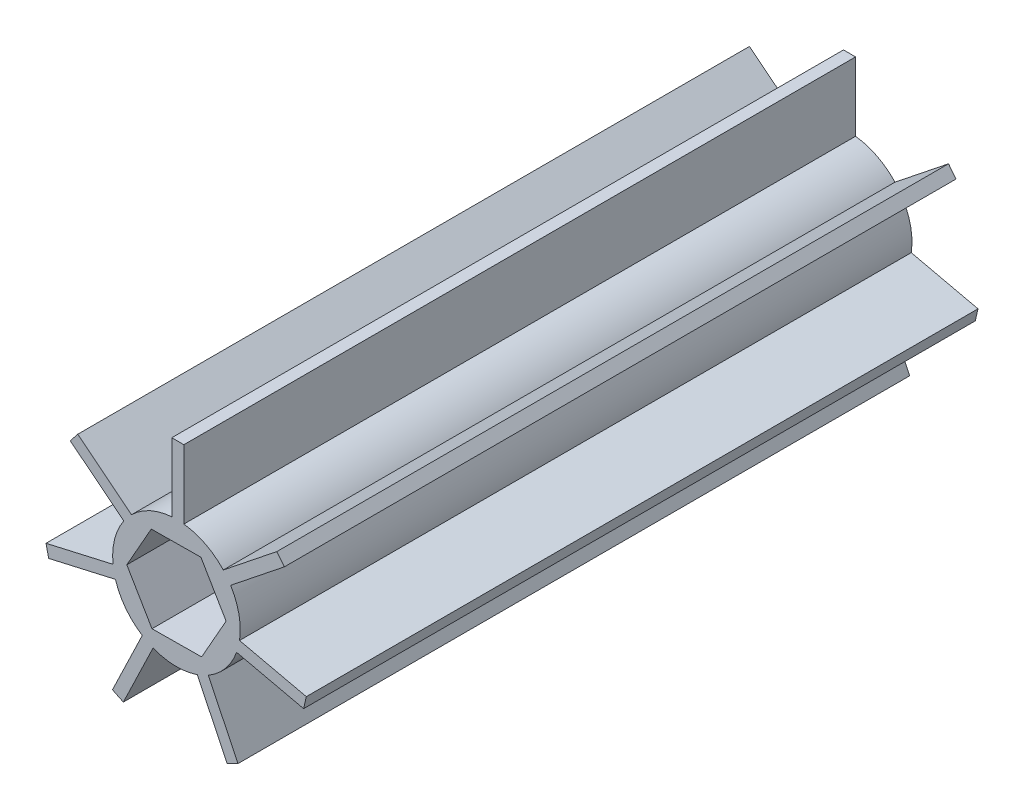
ISO-10303-21;
HEADER;
FILE_DESCRIPTION(('STEP AP214'),'2;1');
FILE_NAME('part.step','',(''),(''),'','','');
FILE_SCHEMA(('AUTOMOTIVE_DESIGN { 1 0 10303 214 1 1 1 1 }'));
ENDSEC;
DATA;
#1=APPLICATION_CONTEXT('core data for automotive mechanical design processes');
#2=APPLICATION_PROTOCOL_DEFINITION('international standard','automotive_design',2000,#1);
#3=PRODUCT_CONTEXT('',#1,'mechanical');
#4=PRODUCT('Part','Part','',(#3));
#5=PRODUCT_RELATED_PRODUCT_CATEGORY('part','',(#4));
#6=PRODUCT_DEFINITION_FORMATION('','',#4);
#7=PRODUCT_DEFINITION_CONTEXT('part definition',#1,'design');
#8=PRODUCT_DEFINITION('design','',#6,#7);
#9=PRODUCT_DEFINITION_SHAPE('','',#8);
#10=(LENGTH_UNIT() NAMED_UNIT(*) SI_UNIT(.MILLI.,.METRE.));
#11=(NAMED_UNIT(*) PLANE_ANGLE_UNIT() SI_UNIT($,.RADIAN.));
#12=(NAMED_UNIT(*) SI_UNIT($,.STERADIAN.) SOLID_ANGLE_UNIT());
#13=UNCERTAINTY_MEASURE_WITH_UNIT(LENGTH_MEASURE(1.E-05),#10,'distance_accuracy_value','');
#14=(GEOMETRIC_REPRESENTATION_CONTEXT(3) GLOBAL_UNCERTAINTY_ASSIGNED_CONTEXT((#13)) GLOBAL_UNIT_ASSIGNED_CONTEXT((#10,
#11,#12)) REPRESENTATION_CONTEXT('',''));
#15=CARTESIAN_POINT('',(0.,0.,0.));
#16=DIRECTION('',(0.,0.,1.));
#17=DIRECTION('',(1.,0.,0.));
#18=AXIS2_PLACEMENT_3D('',#15,#16,#17);
#19=CARTESIAN_POINT('',(0.,0.,-76.2));
#20=DIRECTION('',(0.,0.,1.));
#21=DIRECTION('',(1.,0.,0.));
#22=AXIS2_PLACEMENT_3D('',#19,#20,#21);
#23=CYLINDRICAL_SURFACE('',#22,7.239);
#24=DIRECTION('',(0.,0.,1.));
#25=VECTOR('',#24,1.);
#26=CARTESIAN_POINT('',(-5.09725781437556,5.14014433394503,-76.2));
#27=LINE('',#26,#25);
#28=CARTESIAN_POINT('',(-5.09725781437557,5.14014433394503,0.));
#29=VERTEX_POINT('',#28);
#30=CARTESIAN_POINT('',(-5.09725781437557,5.14014433394503,-76.2));
#31=VERTEX_POINT('',#30);
#32=EDGE_CURVE('E11',#29,#31,#27,.F.);
#33=ORIENTED_EDGE('',*,*,#32,.F.);
#34=CARTESIAN_POINT('',(0.,0.,0.));
#35=DIRECTION('',(0.,0.,1.));
#36=DIRECTION('',(1.,0.,0.));
#37=AXIS2_PLACEMENT_3D('',#34,#35,#36);
#38=CIRCLE('',#37,7.239);
#39=CARTESIAN_POINT('',(-0.5309616,7.21950142179676,0.));
#40=VERTEX_POINT('',#39);
#41=EDGE_CURVE('E439',#40,#29,#38,.T.);
#42=ORIENTED_EDGE('',*,*,#41,.F.);
#43=DIRECTION('',(0.,0.,1.));
#44=VECTOR('',#43,1.);
#45=CARTESIAN_POINT('',(-0.5309616,7.21950142179676,-76.2));
#46=LINE('',#45,#44);
#47=CARTESIAN_POINT('',(-0.5309616,7.21950142179676,-76.2));
#48=VERTEX_POINT('',#47);
#49=EDGE_CURVE('E436',#40,#48,#46,.F.);
#50=ORIENTED_EDGE('',*,*,#49,.T.);
#51=CARTESIAN_POINT('',(0.,0.,-76.2));
#52=DIRECTION('',(0.,0.,1.));
#53=DIRECTION('',(1.,0.,0.));
#54=AXIS2_PLACEMENT_3D('',#51,#52,#53);
#55=CIRCLE('',#54,7.239);
#56=EDGE_CURVE('E433',#48,#31,#55,.T.);
#57=ORIENTED_EDGE('',*,*,#56,.T.);
#58=EDGE_LOOP('',(#33,#42,#50,#57));
#59=FACE_BOUND('',#58,.T.);
#60=ADVANCED_FACE('F36',(#59),#23,.T.);
#61=DIRECTION('',(0.,0.,1.));
#62=VECTOR('',#61,1.);
#63=CARTESIAN_POINT('',(-5.97548264206201,4.0861630161333,-76.2));
#64=LINE('',#63,#62);
#65=CARTESIAN_POINT('',(-5.97548264206201,4.0861630161333,-76.2));
#66=VERTEX_POINT('',#65);
#67=CARTESIAN_POINT('',(-5.97548264206201,4.0861630161333,0.));
#68=VERTEX_POINT('',#67);
#69=EDGE_CURVE('E44',#66,#68,#64,.T.);
#70=ORIENTED_EDGE('',*,*,#69,.F.);
#71=CARTESIAN_POINT('',(-7.19681492941579,-0.780369061238331,-76.2));
#72=VERTEX_POINT('',#71);
#73=EDGE_CURVE('E437',#66,#72,#55,.T.);
#74=ORIENTED_EDGE('',*,*,#73,.T.);
#75=DIRECTION('',(0.,0.,1.));
#76=VECTOR('',#75,1.);
#77=CARTESIAN_POINT('',(-7.19681492941579,-0.780369061238331,-76.2));
#78=LINE('',#77,#76);
#79=CARTESIAN_POINT('',(-7.19681492941579,-0.780369061238331,0.));
#80=VERTEX_POINT('',#79);
#81=EDGE_CURVE('E495',#80,#72,#78,.F.);
#82=ORIENTED_EDGE('',*,*,#81,.F.);
#83=EDGE_CURVE('E442',#68,#80,#38,.T.);
#84=ORIENTED_EDGE('',*,*,#83,.F.);
#85=EDGE_LOOP('',(#70,#74,#82,#84));
#86=FACE_BOUND('',#85,.T.);
#87=ADVANCED_FACE('F507',(#86),#23,.T.);
#88=DIRECTION('',(0.,0.,1.));
#89=VECTOR('',#88,1.);
#90=CARTESIAN_POINT('',(-6.92034337701907,-2.1241394832139,-76.2));
#91=LINE('',#90,#89);
#92=CARTESIAN_POINT('',(-6.92034337701907,-2.1241394832139,-76.2));
#93=VERTEX_POINT('',#92);
#94=CARTESIAN_POINT('',(-6.92034337701907,-2.1241394832139,0.));
#95=VERTEX_POINT('',#94);
#96=EDGE_CURVE('E492',#93,#95,#91,.T.);
#97=ORIENTED_EDGE('',*,*,#96,.F.);
#98=CARTESIAN_POINT('',(-3.87702361433526,-6.11324863668138,-76.2));
#99=VERTEX_POINT('',#98);
#100=EDGE_CURVE('E554',#93,#99,#55,.T.);
#101=ORIENTED_EDGE('',*,*,#100,.T.);
#102=DIRECTION('',(0.,0.,1.));
#103=VECTOR('',#102,1.);
#104=CARTESIAN_POINT('',(-3.87702361433526,-6.11324863668138,-76.2));
#105=LINE('',#104,#103);
#106=CARTESIAN_POINT('',(-3.87702361433526,-6.11324863668138,0.));
#107=VERTEX_POINT('',#106);
#108=EDGE_CURVE('E489',#107,#99,#105,.F.);
#109=ORIENTED_EDGE('',*,*,#108,.F.);
#110=EDGE_CURVE('E510',#95,#107,#38,.T.);
#111=ORIENTED_EDGE('',*,*,#110,.F.);
#112=EDGE_LOOP('',(#97,#101,#109,#111));
#113=FACE_BOUND('',#112,.T.);
#114=ADVANCED_FACE('F594',(#113),#23,.T.);
#115=DIRECTION('',(0.,0.,1.));
#116=VECTOR('',#115,1.);
#117=CARTESIAN_POINT('',(-2.65404439980201,-6.73492162715199,-76.2));
#118=LINE('',#117,#116);
#119=CARTESIAN_POINT('',(-2.65404439980201,-6.73492162715199,-76.2));
#120=VERTEX_POINT('',#119);
#121=CARTESIAN_POINT('',(-2.65404439980201,-6.73492162715199,0.));
#122=VERTEX_POINT('',#121);
#123=EDGE_CURVE('E486',#120,#122,#118,.T.);
#124=ORIENTED_EDGE('',*,*,#123,.F.);
#125=CARTESIAN_POINT('',(2.36224555920875,-6.84272730115694,-76.2));
#126=VERTEX_POINT('',#125);
#127=EDGE_CURVE('E555',#120,#126,#55,.T.);
#128=ORIENTED_EDGE('',*,*,#127,.T.);
#129=DIRECTION('',(0.,0.,1.));
#130=VECTOR('',#129,1.);
#131=CARTESIAN_POINT('',(2.36224555920875,-6.84272730115694,-76.2));
#132=LINE('',#131,#130);
#133=CARTESIAN_POINT('',(2.36224555920875,-6.84272730115694,0.));
#134=VERTEX_POINT('',#133);
#135=EDGE_CURVE('E483',#134,#126,#132,.F.);
#136=ORIENTED_EDGE('',*,*,#135,.F.);
#137=EDGE_CURVE('E512',#122,#134,#38,.T.);
#138=ORIENTED_EDGE('',*,*,#137,.F.);
#139=EDGE_LOOP('',(#124,#128,#136,#138));
#140=FACE_BOUND('',#139,.T.);
#141=ADVANCED_FACE('F609',(#140),#23,.T.);
#142=DIRECTION('',(0.,0.,1.));
#143=VECTOR('',#142,1.);
#144=CARTESIAN_POINT('',(3.61080414310541,-6.27417041848026,-76.2));
#145=LINE('',#144,#143);
#146=CARTESIAN_POINT('',(3.61080414310541,-6.27417041848026,-76.2));
#147=VERTEX_POINT('',#146);
#148=CARTESIAN_POINT('',(3.61080414310541,-6.27417041848026,0.));
#149=VERTEX_POINT('',#148);
#150=EDGE_CURVE('E480',#147,#149,#145,.T.);
#151=ORIENTED_EDGE('',*,*,#150,.F.);
#152=CARTESIAN_POINT('',(6.82269564564073,-2.41949274166198,-76.2));
#153=VERTEX_POINT('',#152);
#154=EDGE_CURVE('E558',#147,#153,#55,.T.);
#155=ORIENTED_EDGE('',*,*,#154,.T.);
#156=DIRECTION('',(0.,0.,1.));
#157=VECTOR('',#156,1.);
#158=CARTESIAN_POINT('',(6.82269564564073,-2.41949274166197,-76.2));
#159=LINE('',#158,#157);
#160=CARTESIAN_POINT('',(6.82269564564073,-2.41949274166198,0.));
#161=VERTEX_POINT('',#160);
#162=EDGE_CURVE('E477',#161,#153,#159,.F.);
#163=ORIENTED_EDGE('',*,*,#162,.F.);
#164=EDGE_CURVE('E515',#149,#161,#38,.T.);
#165=ORIENTED_EDGE('',*,*,#164,.F.);
#166=EDGE_LOOP('',(#151,#155,#163,#165));
#167=FACE_BOUND('',#166,.T.);
#168=ADVANCED_FACE('F604',(#167),#23,.T.);
#169=DIRECTION('',(0.,0.,1.));
#170=VECTOR('',#169,1.);
#171=CARTESIAN_POINT('',(7.15664351927297,-1.08884091494037,-76.2));
#172=LINE('',#171,#170);
#173=CARTESIAN_POINT('',(7.15664351927297,-1.08884091494037,-76.2));
#174=VERTEX_POINT('',#173);
#175=CARTESIAN_POINT('',(7.15664351927297,-1.08884091494037,0.));
#176=VERTEX_POINT('',#175);
#177=EDGE_CURVE('E474',#174,#176,#172,.T.);
#178=ORIENTED_EDGE('',*,*,#177,.F.);
#179=CARTESIAN_POINT('',(6.14551675327719,3.82566920096201,-76.2));
#180=VERTEX_POINT('',#179);
#181=EDGE_CURVE('E561',#174,#180,#55,.T.);
#182=ORIENTED_EDGE('',*,*,#181,.T.);
#183=DIRECTION('',(0.,0.,1.));
#184=VECTOR('',#183,1.);
#185=CARTESIAN_POINT('',(6.14551675327719,3.82566920096201,-76.2));
#186=LINE('',#185,#184);
#187=CARTESIAN_POINT('',(6.14551675327719,3.82566920096201,0.));
#188=VERTEX_POINT('',#187);
#189=EDGE_CURVE('E471',#188,#180,#186,.F.);
#190=ORIENTED_EDGE('',*,*,#189,.F.);
#191=EDGE_CURVE('E518',#176,#188,#38,.T.);
#192=ORIENTED_EDGE('',*,*,#191,.F.);
#193=EDGE_LOOP('',(#178,#182,#190,#192));
#194=FACE_BOUND('',#193,.T.);
#195=ADVANCED_FACE('F566',(#194),#23,.T.);
#196=CARTESIAN_POINT('',(0.8406384,0.,-76.2));
#197=DIRECTION('',(1.,0.,0.));
#198=DIRECTION('',(0.,0.,-1.));
#199=AXIS2_PLACEMENT_3D('',#196,#197,#198);
#200=PLANE('',#199);
#201=DIRECTION('',(0.,0.,1.));
#202=VECTOR('',#201,1.);
#203=CARTESIAN_POINT('',(0.8406384,7.19002420583167,-76.2));
#204=LINE('',#203,#202);
#205=CARTESIAN_POINT('',(0.8406384,7.19002420583168,-76.2));
#206=VERTEX_POINT('',#205);
#207=CARTESIAN_POINT('',(0.8406384,7.19002420583168,0.));
#208=VERTEX_POINT('',#207);
#209=EDGE_CURVE('E444',#206,#208,#204,.T.);
#210=ORIENTED_EDGE('',*,*,#209,.F.);
#211=DIRECTION('',(0.,1.,0.));
#212=VECTOR('',#211,1.);
#213=CARTESIAN_POINT('',(0.8406384,0.,-76.2));
#214=LINE('',#213,#212);
#215=CARTESIAN_POINT('',(0.8406384,14.9878436421136,-76.2));
#216=VERTEX_POINT('',#215);
#217=EDGE_CURVE('E448',#206,#216,#214,.T.);
#218=ORIENTED_EDGE('',*,*,#217,.T.);
#219=DIRECTION('',(0.,0.,1.));
#220=VECTOR('',#219,1.);
#221=CARTESIAN_POINT('',(0.8406384,14.9878436421136,-76.2));
#222=LINE('',#221,#220);
#223=CARTESIAN_POINT('',(0.8406384,14.9878436421136,0.));
#224=VERTEX_POINT('',#223);
#225=EDGE_CURVE('E457',#216,#224,#222,.T.);
#226=ORIENTED_EDGE('',*,*,#225,.T.);
#227=DIRECTION('',(0.,1.,0.));
#228=VECTOR('',#227,1.);
#229=CARTESIAN_POINT('',(0.8406384,0.,0.));
#230=LINE('',#229,#228);
#231=EDGE_CURVE('E447',#208,#224,#230,.T.);
#232=ORIENTED_EDGE('',*,*,#231,.F.);
#233=EDGE_LOOP('',(#210,#218,#226,#232));
#234=FACE_BOUND('',#233,.T.);
#235=ADVANCED_FACE('F38',(#234),#200,.T.);
#236=CARTESIAN_POINT('',(-0.5309616,0.,-76.2));
#237=DIRECTION('',(-1.,0.,0.));
#238=DIRECTION('',(0.,0.,1.));
#239=AXIS2_PLACEMENT_3D('',#236,#237,#238);
#240=PLANE('',#239);
#241=ORIENTED_EDGE('',*,*,#49,.F.);
#242=DIRECTION('',(0.,-1.,0.));
#243=VECTOR('',#242,1.);
#244=CARTESIAN_POINT('',(-0.5309616,0.,0.));
#245=LINE('',#244,#243);
#246=CARTESIAN_POINT('',(-0.5309616,14.9878436421136,0.));
#247=VERTEX_POINT('',#246);
#248=EDGE_CURVE('E451',#247,#40,#245,.T.);
#249=ORIENTED_EDGE('',*,*,#248,.F.);
#250=DIRECTION('',(0.,0.,1.));
#251=VECTOR('',#250,1.);
#252=CARTESIAN_POINT('',(-0.5309616,14.9878436421136,-76.2));
#253=LINE('',#252,#251);
#254=CARTESIAN_POINT('',(-0.5309616,14.9878436421136,-76.2));
#255=VERTEX_POINT('',#254);
#256=EDGE_CURVE('E464',#255,#247,#253,.T.);
#257=ORIENTED_EDGE('',*,*,#256,.F.);
#258=DIRECTION('',(0.,-1.,0.));
#259=VECTOR('',#258,1.);
#260=CARTESIAN_POINT('',(-0.5309616,0.,-76.2));
#261=LINE('',#260,#259);
#262=EDGE_CURVE('E454',#255,#48,#261,.T.);
#263=ORIENTED_EDGE('',*,*,#262,.T.);
#264=EDGE_LOOP('',(#241,#249,#257,#263));
#265=FACE_BOUND('',#264,.T.);
#266=ADVANCED_FACE('F539',(#265),#240,.T.);
#267=CARTESIAN_POINT('',(-0.5309616,14.9878436421136,-76.2));
#268=DIRECTION('',(0.,1.,0.));
#269=DIRECTION('',(-1.,0.,0.));
#270=AXIS2_PLACEMENT_3D('',#267,#268,#269);
#271=PLANE('',#270);
#272=DIRECTION('',(-1.,0.,0.));
#273=VECTOR('',#272,1.);
#274=CARTESIAN_POINT('',(-0.5309616,14.9878436421136,0.));
#275=LINE('',#274,#273);
#276=EDGE_CURVE('E459',#224,#247,#275,.T.);
#277=ORIENTED_EDGE('',*,*,#276,.F.);
#278=ORIENTED_EDGE('',*,*,#225,.F.);
#279=DIRECTION('',(-1.,0.,0.));
#280=VECTOR('',#279,1.);
#281=CARTESIAN_POINT('',(-0.5309616,14.9878436421136,-76.2));
#282=LINE('',#281,#280);
#283=EDGE_CURVE('E450',#216,#255,#282,.T.);
#284=ORIENTED_EDGE('',*,*,#283,.T.);
#285=ORIENTED_EDGE('',*,*,#256,.T.);
#286=EDGE_LOOP('',(#277,#278,#284,#285));
#287=FACE_BOUND('',#286,.T.);
#288=ADVANCED_FACE('F535',(#287),#271,.T.);
#289=CARTESIAN_POINT('',(0.,0.,-76.2));
#290=DIRECTION('',(0.,0.,-1.));
#291=DIRECTION('',(-1.,0.,0.));
#292=AXIS2_PLACEMENT_3D('',#289,#290,#291);
#293=PLANE('',#292);
#294=DIRECTION('',(0.492619747113076,0.870244669477641,0.));
#295=VECTOR('',#294,1.);
#296=CARTESIAN_POINT('',(2.85697830858125,-4.85268783915638,-76.2));
#297=LINE('',#296,#295);
#298=CARTESIAN_POINT('',(2.85697830858125,-4.85268783915638,-76.2));
#299=VERTEX_POINT('',#298);
#300=CARTESIAN_POINT('',(5.63104009963586,0.047871873714276,-76.2));
#301=VERTEX_POINT('',#300);
#302=EDGE_CURVE('E258',#299,#301,#297,.T.);
#303=ORIENTED_EDGE('',*,*,#302,.T.);
#304=DIRECTION('',(-0.507344117719091,0.861743550144611,0.));
#305=VECTOR('',#304,1.);
#306=CARTESIAN_POINT('',(5.63104009963586,0.047871873714276,-76.2));
#307=LINE('',#306,#305);
#308=CARTESIAN_POINT('',(2.77406179105461,4.90055971287065,-76.2));
#309=VERTEX_POINT('',#308);
#310=EDGE_CURVE('E267',#301,#309,#307,.T.);
#311=ORIENTED_EDGE('',*,*,#310,.T.);
#312=DIRECTION('',(-0.999963864832168,-0.00850111933302995,0.));
#313=VECTOR('',#312,1.);
#314=CARTESIAN_POINT('',(2.77406179105461,4.90055971287065,-76.2));
#315=LINE('',#314,#313);
#316=CARTESIAN_POINT('',(-2.85697830858125,4.85268783915638,-76.2));
#317=VERTEX_POINT('',#316);
#318=EDGE_CURVE('E51',#309,#317,#315,.T.);
#319=ORIENTED_EDGE('',*,*,#318,.T.);
#320=DIRECTION('',(-0.492619747113076,-0.870244669477641,0.));
#321=VECTOR('',#320,1.);
#322=CARTESIAN_POINT('',(-2.85697830858125,4.85268783915638,-76.2));
#323=LINE('',#322,#321);
#324=CARTESIAN_POINT('',(-5.63104009963586,-0.0478718737142743,-76.2));
#325=VERTEX_POINT('',#324);
#326=EDGE_CURVE('E282',#317,#325,#323,.T.);
#327=ORIENTED_EDGE('',*,*,#326,.T.);
#328=DIRECTION('',(0.507344117719091,-0.861743550144611,0.));
#329=VECTOR('',#328,1.);
#330=CARTESIAN_POINT('',(-5.63104009963586,-0.0478718737142743,-76.2));
#331=LINE('',#330,#329);
#332=CARTESIAN_POINT('',(-2.77406179105461,-4.90055971287065,-76.2));
#333=VERTEX_POINT('',#332);
#334=EDGE_CURVE('E285',#325,#333,#331,.T.);
#335=ORIENTED_EDGE('',*,*,#334,.T.);
#336=DIRECTION('',(0.999963864832168,0.00850111933303011,0.));
#337=VECTOR('',#336,1.);
#338=CARTESIAN_POINT('',(-2.77406179105461,-4.90055971287065,-76.2));
#339=LINE('',#338,#337);
#340=EDGE_CURVE('E264',#333,#299,#339,.T.);
#341=ORIENTED_EDGE('',*,*,#340,.T.);
#342=EDGE_LOOP('',(#303,#311,#319,#327,#335,#341));
#343=FACE_BOUND('',#342,.T.);
#344=ORIENTED_EDGE('',*,*,#73,.F.);
#345=DIRECTION('',(0.781831482468031,-0.623489801858732,0.));
#346=VECTOR('',#345,1.);
#347=CARTESIAN_POINT('',(-0.331049142778595,-0.415122494861598,-76.2));
#348=LINE('',#347,#346);
#349=CARTESIAN_POINT('',(-12.0490171564913,8.92964516784947,-76.2));
#350=VERTEX_POINT('',#349);
#351=EDGE_CURVE('E420',#350,#66,#348,.T.);
#352=ORIENTED_EDGE('',*,*,#351,.F.);
#353=DIRECTION('',(-0.623489801858731,-0.781831482468032,0.));
#354=VECTOR('',#353,1.);
#355=CARTESIAN_POINT('',(-12.0490171564913,8.92964516784947,-76.2));
#356=LINE('',#355,#354);
#357=CARTESIAN_POINT('',(-11.1938385442619,10.0020052292026,-76.2));
#358=VERTEX_POINT('',#357);
#359=EDGE_CURVE('E416',#358,#350,#356,.T.);
#360=ORIENTED_EDGE('',*,*,#359,.F.);
#361=DIRECTION('',(-0.781831482468031,0.623489801858732,0.));
#362=VECTOR('',#361,1.);
#363=CARTESIAN_POINT('',(0.524129469450841,0.657237566491554,-76.2));
#364=LINE('',#363,#362);
#365=EDGE_CURVE('E414',#31,#358,#364,.T.);
#366=ORIENTED_EDGE('',*,*,#365,.F.);
#367=ORIENTED_EDGE('',*,*,#56,.F.);
#368=ORIENTED_EDGE('',*,*,#262,.F.);
#369=ORIENTED_EDGE('',*,*,#283,.F.);
#370=ORIENTED_EDGE('',*,*,#217,.F.);
#371=CARTESIAN_POINT('',(5.31338435650475,4.91640800585657,-76.2));
#372=VERTEX_POINT('',#371);
#373=EDGE_CURVE('E438',#372,#206,#55,.T.);
#374=ORIENTED_EDGE('',*,*,#373,.F.);
#375=DIRECTION('',(-0.781831482468022,-0.623489801858743,0.));
#376=VECTOR('',#375,1.);
#377=CARTESIAN_POINT('',(-0.331049142778601,0.415122494861593,-76.2));
#378=LINE('',#377,#376);
#379=CARTESIAN_POINT('',(11.386918870934,9.75989015757283,-76.2));
#380=VERTEX_POINT('',#379);
#381=EDGE_CURVE('E315',#380,#372,#378,.T.);
#382=ORIENTED_EDGE('',*,*,#381,.F.);
#383=DIRECTION('',(-0.623489801858744,0.781831482468021,0.));
#384=VECTOR('',#383,1.);
#385=CARTESIAN_POINT('',(11.386918870934,9.75989015757283,-76.2));
#386=LINE('',#385,#384);
#387=CARTESIAN_POINT('',(12.2420974831635,8.68753009621969,-76.2));
#388=VERTEX_POINT('',#387);
#389=EDGE_CURVE('E311',#388,#380,#386,.T.);
#390=ORIENTED_EDGE('',*,*,#389,.F.);
#391=DIRECTION('',(0.781831482468022,0.623489801858743,0.));
#392=VECTOR('',#391,1.);
#393=CARTESIAN_POINT('',(0.524129469450851,-0.657237566491546,-76.2));
#394=LINE('',#393,#392);
#395=EDGE_CURVE('E309',#180,#388,#394,.T.);
#396=ORIENTED_EDGE('',*,*,#395,.F.);
#397=ORIENTED_EDGE('',*,*,#181,.F.);
#398=DIRECTION('',(-0.974927912181826,0.222520933956305,0.));
#399=VECTOR('',#398,1.);
#400=CARTESIAN_POINT('',(0.118150071126934,0.517649284136722,-76.2));
#401=LINE('',#400,#399);
#402=CARTESIAN_POINT('',(14.7302171812404,-2.81745968109747,-76.2));
#403=VERTEX_POINT('',#402);
#404=EDGE_CURVE('E336',#403,#174,#401,.T.);
#405=ORIENTED_EDGE('',*,*,#404,.F.);
#406=DIRECTION('',(0.222520933956304,0.974927912181826,0.));
#407=VECTOR('',#406,1.);
#408=CARTESIAN_POINT('',(14.7302171812404,-2.81745968109747,-76.2));
#409=LINE('',#408,#407);
#410=CARTESIAN_POINT('',(14.4250074682259,-4.15467080544606,-76.2));
#411=VERTEX_POINT('',#410);
#412=EDGE_CURVE('E332',#411,#403,#409,.T.);
#413=ORIENTED_EDGE('',*,*,#412,.F.);
#414=DIRECTION('',(0.974927912181826,-0.222520933956305,0.));
#415=VECTOR('',#414,1.);
#416=CARTESIAN_POINT('',(-0.187059641887534,-0.819561840211871,-76.2));
#417=LINE('',#416,#415);
#418=EDGE_CURVE('E330',#153,#411,#417,.T.);
#419=ORIENTED_EDGE('',*,*,#418,.F.);
#420=ORIENTED_EDGE('',*,*,#154,.F.);
#421=DIRECTION('',(-0.433883739117565,0.900968867902416,0.));
#422=VECTOR('',#421,1.);
#423=CARTESIAN_POINT('',(0.478379871651655,0.230375604335845,-76.2));
#424=LINE('',#423,#422);
#425=CARTESIAN_POINT('',(6.98136151240134,-13.2732049141977,-76.2));
#426=VERTEX_POINT('',#425);
#427=EDGE_CURVE('E357',#426,#147,#424,.T.);
#428=ORIENTED_EDGE('',*,*,#427,.F.);
#429=DIRECTION('',(0.900968867902415,0.433883739117566,0.));
#430=VECTOR('',#429,1.);
#431=CARTESIAN_POINT('',(6.98136151240134,-13.2732049141977,-76.2));
#432=LINE('',#431,#430);
#433=CARTESIAN_POINT('',(5.74559261318638,-13.8683198507713,-76.2));
#434=VERTEX_POINT('',#433);
#435=EDGE_CURVE('E353',#434,#426,#432,.T.);
#436=ORIENTED_EDGE('',*,*,#435,.F.);
#437=DIRECTION('',(0.433883739117565,-0.900968867902416,0.));
#438=VECTOR('',#437,1.);
#439=CARTESIAN_POINT('',(-0.757389027563298,-0.364739332237807,-76.2));
#440=LINE('',#439,#438);
#441=EDGE_CURVE('E351',#126,#434,#440,.T.);
#442=ORIENTED_EDGE('',*,*,#441,.F.);
#443=ORIENTED_EDGE('',*,*,#127,.F.);
#444=DIRECTION('',(0.433883739117553,0.900968867902422,0.));
#445=VECTOR('',#444,1.);
#446=CARTESIAN_POINT('',(0.478379871651659,-0.230375604335838,-76.2));
#447=LINE('',#446,#445);
#448=CARTESIAN_POINT('',(-6.02460176909783,-13.7339561228694,-76.2));
#449=VERTEX_POINT('',#448);
#450=EDGE_CURVE('E378',#449,#120,#447,.T.);
#451=ORIENTED_EDGE('',*,*,#450,.F.);
#452=DIRECTION('',(0.900968867902422,-0.433883739117551,0.));
#453=VECTOR('',#452,1.);
#454=CARTESIAN_POINT('',(-6.02460176909783,-13.7339561228694,-76.2));
#455=LINE('',#454,#453);
#456=CARTESIAN_POINT('',(-7.2603706683128,-13.1388411862958,-76.2));
#457=VERTEX_POINT('',#456);
#458=EDGE_CURVE('E374',#457,#449,#455,.T.);
#459=ORIENTED_EDGE('',*,*,#458,.F.);
#460=DIRECTION('',(-0.433883739117553,-0.900968867902422,0.));
#461=VECTOR('',#460,1.);
#462=CARTESIAN_POINT('',(-0.757389027563303,0.364739332237797,-76.2));
#463=LINE('',#462,#461);
#464=EDGE_CURVE('E372',#99,#457,#463,.T.);
#465=ORIENTED_EDGE('',*,*,#464,.F.);
#466=ORIENTED_EDGE('',*,*,#100,.F.);
#467=DIRECTION('',(0.974927912181823,0.222520933956318,0.));
#468=VECTOR('',#467,1.);
#469=CARTESIAN_POINT('',(0.118150071126941,-0.51764928413672,-76.2));
#470=LINE('',#469,#468);
#471=CARTESIAN_POINT('',(-14.4939170389865,-3.85275824937111,-76.2));
#472=VERTEX_POINT('',#471);
#473=EDGE_CURVE('E399',#472,#93,#470,.T.);
#474=ORIENTED_EDGE('',*,*,#473,.F.);
#475=DIRECTION('',(0.222520933956319,-0.974927912181822,0.));
#476=VECTOR('',#475,1.);
#477=CARTESIAN_POINT('',(-14.4939170389865,-3.85275824937111,-76.2));
#478=LINE('',#477,#476);
#479=CARTESIAN_POINT('',(-14.799126752001,-2.51554712502252,-76.2));
#480=VERTEX_POINT('',#479);
#481=EDGE_CURVE('E395',#480,#472,#478,.T.);
#482=ORIENTED_EDGE('',*,*,#481,.F.);
#483=DIRECTION('',(-0.974927912181823,-0.222520933956318,0.));
#484=VECTOR('',#483,1.);
#485=CARTESIAN_POINT('',(-0.187059641887545,0.819561840211868,-76.2));
#486=LINE('',#485,#484);
#487=EDGE_CURVE('E393',#72,#480,#486,.T.);
#488=ORIENTED_EDGE('',*,*,#487,.F.);
#489=EDGE_LOOP('',(#344,#352,#360,#366,#367,#368,#369,#370,#374,#382,#390,#396,#397,#405,#413,
#419,#420,#428,#436,#442,#443,#451,#459,#465,#466,#474,#482,#488));
#490=FACE_BOUND('',#489,.T.);
#491=ADVANCED_FACE('F271',(#343,#490),#293,.T.);
#492=CARTESIAN_POINT('',(0.,0.,0.));
#493=DIRECTION('',(0.,0.,-1.));
#494=DIRECTION('',(-1.,0.,0.));
#495=AXIS2_PLACEMENT_3D('',#492,#493,#494);
#496=PLANE('',#495);
#497=DIRECTION('',(-0.507344117719091,0.861743550144611,0.));
#498=VECTOR('',#497,1.);
#499=CARTESIAN_POINT('',(5.63104009963586,0.047871873714276,0.));
#500=LINE('',#499,#498);
#501=CARTESIAN_POINT('',(5.63104009963586,0.0478718737142755,0.));
#502=VERTEX_POINT('',#501);
#503=CARTESIAN_POINT('',(2.77406179105461,4.90055971287065,0.));
#504=VERTEX_POINT('',#503);
#505=EDGE_CURVE('E289',#502,#504,#500,.T.);
#506=ORIENTED_EDGE('',*,*,#505,.F.);
#507=DIRECTION('',(0.492619747113076,0.870244669477641,0.));
#508=VECTOR('',#507,1.);
#509=CARTESIAN_POINT('',(2.85697830858125,-4.85268783915638,0.));
#510=LINE('',#509,#508);
#511=CARTESIAN_POINT('',(2.85697830858125,-4.85268783915638,0.));
#512=VERTEX_POINT('',#511);
#513=EDGE_CURVE('E59',#512,#502,#510,.T.);
#514=ORIENTED_EDGE('',*,*,#513,.F.);
#515=DIRECTION('',(0.999963864832168,0.00850111933303011,0.));
#516=VECTOR('',#515,1.);
#517=CARTESIAN_POINT('',(-2.77406179105461,-4.90055971287065,0.));
#518=LINE('',#517,#516);
#519=CARTESIAN_POINT('',(-2.77406179105461,-4.90055971287065,0.));
#520=VERTEX_POINT('',#519);
#521=EDGE_CURVE('E275',#520,#512,#518,.T.);
#522=ORIENTED_EDGE('',*,*,#521,.F.);
#523=DIRECTION('',(0.507344117719091,-0.861743550144611,0.));
#524=VECTOR('',#523,1.);
#525=CARTESIAN_POINT('',(-5.63104009963586,-0.0478718737142743,0.));
#526=LINE('',#525,#524);
#527=CARTESIAN_POINT('',(-5.63104009963586,-0.0478718737142743,0.));
#528=VERTEX_POINT('',#527);
#529=EDGE_CURVE('E278',#528,#520,#526,.T.);
#530=ORIENTED_EDGE('',*,*,#529,.F.);
#531=DIRECTION('',(-0.492619747113076,-0.870244669477641,0.));
#532=VECTOR('',#531,1.);
#533=CARTESIAN_POINT('',(-2.85697830858125,4.85268783915638,0.));
#534=LINE('',#533,#532);
#535=CARTESIAN_POINT('',(-2.85697830858125,4.85268783915638,0.));
#536=VERTEX_POINT('',#535);
#537=EDGE_CURVE('E294',#536,#528,#534,.T.);
#538=ORIENTED_EDGE('',*,*,#537,.F.);
#539=DIRECTION('',(-0.999963864832168,-0.00850111933302995,0.));
#540=VECTOR('',#539,1.);
#541=CARTESIAN_POINT('',(2.77406179105461,4.90055971287065,0.));
#542=LINE('',#541,#540);
#543=EDGE_CURVE('E291',#504,#536,#542,.T.);
#544=ORIENTED_EDGE('',*,*,#543,.F.);
#545=EDGE_LOOP('',(#506,#514,#522,#530,#538,#544));
#546=FACE_BOUND('',#545,.T.);
#547=DIRECTION('',(0.781831482468031,-0.623489801858732,0.));
#548=VECTOR('',#547,1.);
#549=CARTESIAN_POINT('',(-0.331049142778595,-0.415122494861598,0.));
#550=LINE('',#549,#548);
#551=CARTESIAN_POINT('',(-12.0490171564913,8.92964516784947,0.));
#552=VERTEX_POINT('',#551);
#553=EDGE_CURVE('E417',#552,#68,#550,.T.);
#554=ORIENTED_EDGE('',*,*,#553,.T.);
#555=ORIENTED_EDGE('',*,*,#83,.T.);
#556=DIRECTION('',(-0.974927912181823,-0.222520933956318,0.));
#557=VECTOR('',#556,1.);
#558=CARTESIAN_POINT('',(-0.187059641887545,0.819561840211868,0.));
#559=LINE('',#558,#557);
#560=CARTESIAN_POINT('',(-14.799126752001,-2.51554712502252,0.));
#561=VERTEX_POINT('',#560);
#562=EDGE_CURVE('E390',#80,#561,#559,.T.);
#563=ORIENTED_EDGE('',*,*,#562,.T.);
#564=DIRECTION('',(0.222520933956319,-0.974927912181822,0.));
#565=VECTOR('',#564,1.);
#566=CARTESIAN_POINT('',(-14.4939170389865,-3.85275824937111,0.));
#567=LINE('',#566,#565);
#568=CARTESIAN_POINT('',(-14.4939170389865,-3.85275824937111,0.));
#569=VERTEX_POINT('',#568);
#570=EDGE_CURVE('E404',#561,#569,#567,.T.);
#571=ORIENTED_EDGE('',*,*,#570,.T.);
#572=DIRECTION('',(0.974927912181823,0.222520933956318,0.));
#573=VECTOR('',#572,1.);
#574=CARTESIAN_POINT('',(0.118150071126941,-0.51764928413672,0.));
#575=LINE('',#574,#573);
#576=EDGE_CURVE('E396',#569,#95,#575,.T.);
#577=ORIENTED_EDGE('',*,*,#576,.T.);
#578=ORIENTED_EDGE('',*,*,#110,.T.);
#579=DIRECTION('',(-0.433883739117553,-0.900968867902422,0.));
#580=VECTOR('',#579,1.);
#581=CARTESIAN_POINT('',(-0.757389027563303,0.364739332237797,0.));
#582=LINE('',#581,#580);
#583=CARTESIAN_POINT('',(-7.2603706683128,-13.1388411862958,0.));
#584=VERTEX_POINT('',#583);
#585=EDGE_CURVE('E369',#107,#584,#582,.T.);
#586=ORIENTED_EDGE('',*,*,#585,.T.);
#587=DIRECTION('',(0.900968867902422,-0.433883739117551,0.));
#588=VECTOR('',#587,1.);
#589=CARTESIAN_POINT('',(-6.02460176909783,-13.7339561228694,0.));
#590=LINE('',#589,#588);
#591=CARTESIAN_POINT('',(-6.02460176909783,-13.7339561228694,0.));
#592=VERTEX_POINT('',#591);
#593=EDGE_CURVE('E383',#584,#592,#590,.T.);
#594=ORIENTED_EDGE('',*,*,#593,.T.);
#595=DIRECTION('',(0.433883739117553,0.900968867902422,0.));
#596=VECTOR('',#595,1.);
#597=CARTESIAN_POINT('',(0.478379871651659,-0.230375604335838,0.));
#598=LINE('',#597,#596);
#599=EDGE_CURVE('E375',#592,#122,#598,.T.);
#600=ORIENTED_EDGE('',*,*,#599,.T.);
#601=ORIENTED_EDGE('',*,*,#137,.T.);
#602=DIRECTION('',(0.433883739117565,-0.900968867902416,0.));
#603=VECTOR('',#602,1.);
#604=CARTESIAN_POINT('',(-0.757389027563298,-0.364739332237807,0.));
#605=LINE('',#604,#603);
#606=CARTESIAN_POINT('',(5.74559261318638,-13.8683198507713,0.));
#607=VERTEX_POINT('',#606);
#608=EDGE_CURVE('E348',#134,#607,#605,.T.);
#609=ORIENTED_EDGE('',*,*,#608,.T.);
#610=DIRECTION('',(0.900968867902415,0.433883739117566,0.));
#611=VECTOR('',#610,1.);
#612=CARTESIAN_POINT('',(6.98136151240134,-13.2732049141977,0.));
#613=LINE('',#612,#611);
#614=CARTESIAN_POINT('',(6.98136151240134,-13.2732049141977,0.));
#615=VERTEX_POINT('',#614);
#616=EDGE_CURVE('E362',#607,#615,#613,.T.);
#617=ORIENTED_EDGE('',*,*,#616,.T.);
#618=DIRECTION('',(-0.433883739117565,0.900968867902416,0.));
#619=VECTOR('',#618,1.);
#620=CARTESIAN_POINT('',(0.478379871651655,0.230375604335845,0.));
#621=LINE('',#620,#619);
#622=EDGE_CURVE('E354',#615,#149,#621,.T.);
#623=ORIENTED_EDGE('',*,*,#622,.T.);
#624=ORIENTED_EDGE('',*,*,#164,.T.);
#625=DIRECTION('',(0.974927912181826,-0.222520933956305,0.));
#626=VECTOR('',#625,1.);
#627=CARTESIAN_POINT('',(-0.187059641887534,-0.819561840211871,0.));
#628=LINE('',#627,#626);
#629=CARTESIAN_POINT('',(14.4250074682259,-4.15467080544606,0.));
#630=VERTEX_POINT('',#629);
#631=EDGE_CURVE('E327',#161,#630,#628,.T.);
#632=ORIENTED_EDGE('',*,*,#631,.T.);
#633=DIRECTION('',(0.222520933956304,0.974927912181826,0.));
#634=VECTOR('',#633,1.);
#635=CARTESIAN_POINT('',(14.7302171812404,-2.81745968109747,0.));
#636=LINE('',#635,#634);
#637=CARTESIAN_POINT('',(14.7302171812404,-2.81745968109747,0.));
#638=VERTEX_POINT('',#637);
#639=EDGE_CURVE('E341',#630,#638,#636,.T.);
#640=ORIENTED_EDGE('',*,*,#639,.T.);
#641=DIRECTION('',(-0.974927912181826,0.222520933956305,0.));
#642=VECTOR('',#641,1.);
#643=CARTESIAN_POINT('',(0.118150071126934,0.517649284136722,0.));
#644=LINE('',#643,#642);
#645=EDGE_CURVE('E333',#638,#176,#644,.T.);
#646=ORIENTED_EDGE('',*,*,#645,.T.);
#647=ORIENTED_EDGE('',*,*,#191,.T.);
#648=DIRECTION('',(0.781831482468022,0.623489801858743,0.));
#649=VECTOR('',#648,1.);
#650=CARTESIAN_POINT('',(0.524129469450851,-0.657237566491546,0.));
#651=LINE('',#650,#649);
#652=CARTESIAN_POINT('',(12.2420974831635,8.68753009621969,0.));
#653=VERTEX_POINT('',#652);
#654=EDGE_CURVE('E301',#188,#653,#651,.T.);
#655=ORIENTED_EDGE('',*,*,#654,.T.);
#656=DIRECTION('',(-0.623489801858744,0.781831482468021,0.));
#657=VECTOR('',#656,1.);
#658=CARTESIAN_POINT('',(11.386918870934,9.75989015757283,0.));
#659=LINE('',#658,#657);
#660=CARTESIAN_POINT('',(11.386918870934,9.75989015757283,0.));
#661=VERTEX_POINT('',#660);
#662=EDGE_CURVE('E320',#653,#661,#659,.T.);
#663=ORIENTED_EDGE('',*,*,#662,.T.);
#664=DIRECTION('',(-0.781831482468022,-0.623489801858743,0.));
#665=VECTOR('',#664,1.);
#666=CARTESIAN_POINT('',(-0.331049142778601,0.415122494861593,0.));
#667=LINE('',#666,#665);
#668=CARTESIAN_POINT('',(5.31338435650475,4.91640800585657,0.));
#669=VERTEX_POINT('',#668);
#670=EDGE_CURVE('E312',#661,#669,#667,.T.);
#671=ORIENTED_EDGE('',*,*,#670,.T.);
#672=EDGE_CURVE('E430',#669,#208,#38,.T.);
#673=ORIENTED_EDGE('',*,*,#672,.T.);
#674=ORIENTED_EDGE('',*,*,#231,.T.);
#675=ORIENTED_EDGE('',*,*,#276,.T.);
#676=ORIENTED_EDGE('',*,*,#248,.T.);
#677=ORIENTED_EDGE('',*,*,#41,.T.);
#678=DIRECTION('',(-0.781831482468031,0.623489801858732,0.));
#679=VECTOR('',#678,1.);
#680=CARTESIAN_POINT('',(0.524129469450841,0.657237566491554,0.));
#681=LINE('',#680,#679);
#682=CARTESIAN_POINT('',(-11.1938385442619,10.0020052292026,0.));
#683=VERTEX_POINT('',#682);
#684=EDGE_CURVE('E411',#29,#683,#681,.T.);
#685=ORIENTED_EDGE('',*,*,#684,.T.);
#686=DIRECTION('',(-0.623489801858731,-0.781831482468032,0.));
#687=VECTOR('',#686,1.);
#688=CARTESIAN_POINT('',(-12.0490171564913,8.92964516784947,0.));
#689=LINE('',#688,#687);
#690=EDGE_CURVE('E424',#683,#552,#689,.T.);
#691=ORIENTED_EDGE('',*,*,#690,.T.);
#692=EDGE_LOOP('',(#554,#555,#563,#571,#577,#578,#586,#594,#600,#601,#609,#617,#623,#624,#632,
#640,#646,#647,#655,#663,#671,#673,#674,#675,#676,#677,#685,#691));
#693=FACE_BOUND('',#692,.T.);
#694=ADVANCED_FACE('F522',(#546,#693),#496,.F.);
#695=DIRECTION('',(0.,0.,1.));
#696=VECTOR('',#695,1.);
#697=CARTESIAN_POINT('',(5.31338435650475,4.91640800585657,-76.2));
#698=LINE('',#697,#696);
#699=EDGE_CURVE('E466',#372,#669,#698,.T.);
#700=ORIENTED_EDGE('',*,*,#699,.F.);
#701=ORIENTED_EDGE('',*,*,#373,.T.);
#702=ORIENTED_EDGE('',*,*,#209,.T.);
#703=ORIENTED_EDGE('',*,*,#672,.F.);
#704=EDGE_LOOP('',(#700,#701,#702,#703));
#705=FACE_BOUND('',#704,.T.);
#706=ADVANCED_FACE('F527',(#705),#23,.T.);
#707=CARTESIAN_POINT('',(11.386918870934,9.75989015757283,-76.2));
#708=DIRECTION('',(0.781831482468021,0.623489801858744,0.));
#709=DIRECTION('',(-0.623489801858744,0.781831482468022,0.));
#710=AXIS2_PLACEMENT_3D('',#707,#708,#709);
#711=PLANE('',#710);
#712=ORIENTED_EDGE('',*,*,#662,.F.);
#713=DIRECTION('',(0.,0.,1.));
#714=VECTOR('',#713,1.);
#715=CARTESIAN_POINT('',(12.2420974831635,8.68753009621969,-76.2));
#716=LINE('',#715,#714);
#717=EDGE_CURVE('E318',#388,#653,#716,.T.);
#718=ORIENTED_EDGE('',*,*,#717,.F.);
#719=ORIENTED_EDGE('',*,*,#389,.T.);
#720=DIRECTION('',(0.,0.,1.));
#721=VECTOR('',#720,1.);
#722=CARTESIAN_POINT('',(11.386918870934,9.75989015757283,-76.2));
#723=LINE('',#722,#721);
#724=EDGE_CURVE('E325',#380,#661,#723,.T.);
#725=ORIENTED_EDGE('',*,*,#724,.T.);
#726=EDGE_LOOP('',(#712,#718,#719,#725));
#727=FACE_BOUND('',#726,.T.);
#728=ADVANCED_FACE('F576',(#727),#711,.T.);
#729=CARTESIAN_POINT('',(-0.331049142778601,0.415122494861593,-76.2));
#730=DIRECTION('',(-0.623489801858743,0.781831482468022,0.));
#731=DIRECTION('',(-0.781831482468022,-0.623489801858743,0.));
#732=AXIS2_PLACEMENT_3D('',#729,#730,#731);
#733=PLANE('',#732);
#734=ORIENTED_EDGE('',*,*,#381,.T.);
#735=ORIENTED_EDGE('',*,*,#699,.T.);
#736=ORIENTED_EDGE('',*,*,#670,.F.);
#737=ORIENTED_EDGE('',*,*,#724,.F.);
#738=EDGE_LOOP('',(#734,#735,#736,#737));
#739=FACE_BOUND('',#738,.T.);
#740=ADVANCED_FACE('F578',(#739),#733,.T.);
#741=CARTESIAN_POINT('',(0.524129469450851,-0.657237566491546,-76.2));
#742=DIRECTION('',(0.623489801858743,-0.781831482468022,0.));
#743=DIRECTION('',(0.781831482468022,0.623489801858743,0.));
#744=AXIS2_PLACEMENT_3D('',#741,#742,#743);
#745=PLANE('',#744);
#746=ORIENTED_EDGE('',*,*,#654,.F.);
#747=ORIENTED_EDGE('',*,*,#189,.T.);
#748=ORIENTED_EDGE('',*,*,#395,.T.);
#749=ORIENTED_EDGE('',*,*,#717,.T.);
#750=EDGE_LOOP('',(#746,#747,#748,#749));
#751=FACE_BOUND('',#750,.T.);
#752=ADVANCED_FACE('F570',(#751),#745,.T.);
#753=CARTESIAN_POINT('',(14.7302171812404,-2.81745968109747,-76.2));
#754=DIRECTION('',(0.974927912181826,-0.222520933956304,0.));
#755=DIRECTION('',(0.222520933956304,0.974927912181826,0.));
#756=AXIS2_PLACEMENT_3D('',#753,#754,#755);
#757=PLANE('',#756);
#758=ORIENTED_EDGE('',*,*,#639,.F.);
#759=DIRECTION('',(0.,0.,1.));
#760=VECTOR('',#759,1.);
#761=CARTESIAN_POINT('',(14.4250074682259,-4.15467080544606,-76.2));
#762=LINE('',#761,#760);
#763=EDGE_CURVE('E339',#411,#630,#762,.T.);
#764=ORIENTED_EDGE('',*,*,#763,.F.);
#765=ORIENTED_EDGE('',*,*,#412,.T.);
#766=DIRECTION('',(0.,0.,1.));
#767=VECTOR('',#766,1.);
#768=CARTESIAN_POINT('',(14.7302171812404,-2.81745968109747,-76.2));
#769=LINE('',#768,#767);
#770=EDGE_CURVE('E346',#403,#638,#769,.T.);
#771=ORIENTED_EDGE('',*,*,#770,.T.);
#772=EDGE_LOOP('',(#758,#764,#765,#771));
#773=FACE_BOUND('',#772,.T.);
#774=ADVANCED_FACE('F585',(#773),#757,.T.);
#775=CARTESIAN_POINT('',(0.118150071126934,0.517649284136722,-76.2));
#776=DIRECTION('',(0.222520933956305,0.974927912181826,0.));
#777=DIRECTION('',(-0.974927912181826,0.222520933956305,0.));
#778=AXIS2_PLACEMENT_3D('',#775,#776,#777);
#779=PLANE('',#778);
#780=ORIENTED_EDGE('',*,*,#404,.T.);
#781=ORIENTED_EDGE('',*,*,#177,.T.);
#782=ORIENTED_EDGE('',*,*,#645,.F.);
#783=ORIENTED_EDGE('',*,*,#770,.F.);
#784=EDGE_LOOP('',(#780,#781,#782,#783));
#785=FACE_BOUND('',#784,.T.);
#786=ADVANCED_FACE('F840',(#785),#779,.T.);
#787=CARTESIAN_POINT('',(-0.187059641887534,-0.819561840211871,-76.2));
#788=DIRECTION('',(-0.222520933956305,-0.974927912181826,0.));
#789=DIRECTION('',(0.974927912181826,-0.222520933956305,0.));
#790=AXIS2_PLACEMENT_3D('',#787,#788,#789);
#791=PLANE('',#790);
#792=ORIENTED_EDGE('',*,*,#631,.F.);
#793=ORIENTED_EDGE('',*,*,#162,.T.);
#794=ORIENTED_EDGE('',*,*,#418,.T.);
#795=ORIENTED_EDGE('',*,*,#763,.T.);
#796=EDGE_LOOP('',(#792,#793,#794,#795));
#797=FACE_BOUND('',#796,.T.);
#798=ADVANCED_FACE('F830',(#797),#791,.T.);
#799=CARTESIAN_POINT('',(6.98136151240134,-13.2732049141977,-76.2));
#800=DIRECTION('',(0.433883739117566,-0.900968867902415,0.));
#801=DIRECTION('',(0.900968867902415,0.433883739117566,0.));
#802=AXIS2_PLACEMENT_3D('',#799,#800,#801);
#803=PLANE('',#802);
#804=ORIENTED_EDGE('',*,*,#616,.F.);
#805=DIRECTION('',(0.,0.,1.));
#806=VECTOR('',#805,1.);
#807=CARTESIAN_POINT('',(5.74559261318638,-13.8683198507713,-76.2));
#808=LINE('',#807,#806);
#809=EDGE_CURVE('E360',#434,#607,#808,.T.);
#810=ORIENTED_EDGE('',*,*,#809,.F.);
#811=ORIENTED_EDGE('',*,*,#435,.T.);
#812=DIRECTION('',(0.,0.,1.));
#813=VECTOR('',#812,1.);
#814=CARTESIAN_POINT('',(6.98136151240134,-13.2732049141977,-76.2));
#815=LINE('',#814,#813);
#816=EDGE_CURVE('E367',#426,#615,#815,.T.);
#817=ORIENTED_EDGE('',*,*,#816,.T.);
#818=EDGE_LOOP('',(#804,#810,#811,#817));
#819=FACE_BOUND('',#818,.T.);
#820=ADVANCED_FACE('F622',(#819),#803,.T.);
#821=CARTESIAN_POINT('',(0.478379871651655,0.230375604335845,-76.2));
#822=DIRECTION('',(0.900968867902416,0.433883739117565,0.));
#823=DIRECTION('',(-0.433883739117565,0.900968867902416,0.));
#824=AXIS2_PLACEMENT_3D('',#821,#822,#823);
#825=PLANE('',#824);
#826=ORIENTED_EDGE('',*,*,#427,.T.);
#827=ORIENTED_EDGE('',*,*,#150,.T.);
#828=ORIENTED_EDGE('',*,*,#622,.F.);
#829=ORIENTED_EDGE('',*,*,#816,.F.);
#830=EDGE_LOOP('',(#826,#827,#828,#829));
#831=FACE_BOUND('',#830,.T.);
#832=ADVANCED_FACE('F619',(#831),#825,.T.);
#833=CARTESIAN_POINT('',(-0.757389027563298,-0.364739332237807,-76.2));
#834=DIRECTION('',(-0.900968867902416,-0.433883739117565,0.));
#835=DIRECTION('',(0.433883739117565,-0.900968867902416,0.));
#836=AXIS2_PLACEMENT_3D('',#833,#834,#835);
#837=PLANE('',#836);
#838=ORIENTED_EDGE('',*,*,#608,.F.);
#839=ORIENTED_EDGE('',*,*,#135,.T.);
#840=ORIENTED_EDGE('',*,*,#441,.T.);
#841=ORIENTED_EDGE('',*,*,#809,.T.);
#842=EDGE_LOOP('',(#838,#839,#840,#841));
#843=FACE_BOUND('',#842,.T.);
#844=ADVANCED_FACE('F627',(#843),#837,.T.);
#845=CARTESIAN_POINT('',(-6.02460176909783,-13.7339561228694,-76.2));
#846=DIRECTION('',(-0.433883739117551,-0.900968867902422,0.));
#847=DIRECTION('',(0.900968867902422,-0.433883739117551,0.));
#848=AXIS2_PLACEMENT_3D('',#845,#846,#847);
#849=PLANE('',#848);
#850=ORIENTED_EDGE('',*,*,#593,.F.);
#851=DIRECTION('',(0.,0.,1.));
#852=VECTOR('',#851,1.);
#853=CARTESIAN_POINT('',(-7.2603706683128,-13.1388411862958,-76.2));
#854=LINE('',#853,#852);
#855=EDGE_CURVE('E381',#457,#584,#854,.T.);
#856=ORIENTED_EDGE('',*,*,#855,.F.);
#857=ORIENTED_EDGE('',*,*,#458,.T.);
#858=DIRECTION('',(0.,0.,1.));
#859=VECTOR('',#858,1.);
#860=CARTESIAN_POINT('',(-6.02460176909783,-13.7339561228694,-76.2));
#861=LINE('',#860,#859);
#862=EDGE_CURVE('E388',#449,#592,#861,.T.);
#863=ORIENTED_EDGE('',*,*,#862,.T.);
#864=EDGE_LOOP('',(#850,#856,#857,#863));
#865=FACE_BOUND('',#864,.T.);
#866=ADVANCED_FACE('F634',(#865),#849,.T.);
#867=CARTESIAN_POINT('',(0.478379871651659,-0.230375604335838,-76.2));
#868=DIRECTION('',(0.900968867902422,-0.433883739117553,0.));
#869=DIRECTION('',(0.433883739117553,0.900968867902422,0.));
#870=AXIS2_PLACEMENT_3D('',#867,#868,#869);
#871=PLANE('',#870);
#872=ORIENTED_EDGE('',*,*,#450,.T.);
#873=ORIENTED_EDGE('',*,*,#123,.T.);
#874=ORIENTED_EDGE('',*,*,#599,.F.);
#875=ORIENTED_EDGE('',*,*,#862,.F.);
#876=EDGE_LOOP('',(#872,#873,#874,#875));
#877=FACE_BOUND('',#876,.T.);
#878=ADVANCED_FACE('F630',(#877),#871,.T.);
#879=CARTESIAN_POINT('',(-0.757389027563303,0.364739332237797,-76.2));
#880=DIRECTION('',(-0.900968867902422,0.433883739117553,0.));
#881=DIRECTION('',(-0.433883739117553,-0.900968867902422,0.));
#882=AXIS2_PLACEMENT_3D('',#879,#880,#881);
#883=PLANE('',#882);
#884=ORIENTED_EDGE('',*,*,#585,.F.);
#885=ORIENTED_EDGE('',*,*,#108,.T.);
#886=ORIENTED_EDGE('',*,*,#464,.T.);
#887=ORIENTED_EDGE('',*,*,#855,.T.);
#888=EDGE_LOOP('',(#884,#885,#886,#887));
#889=FACE_BOUND('',#888,.T.);
#890=ADVANCED_FACE('F639',(#889),#883,.T.);
#891=CARTESIAN_POINT('',(-14.4939170389865,-3.85275824937111,-76.2));
#892=DIRECTION('',(-0.974927912181823,-0.222520933956319,0.));
#893=DIRECTION('',(0.222520933956319,-0.974927912181823,0.));
#894=AXIS2_PLACEMENT_3D('',#891,#892,#893);
#895=PLANE('',#894);
#896=ORIENTED_EDGE('',*,*,#570,.F.);
#897=DIRECTION('',(0.,0.,1.));
#898=VECTOR('',#897,1.);
#899=CARTESIAN_POINT('',(-14.799126752001,-2.51554712502252,-76.2));
#900=LINE('',#899,#898);
#901=EDGE_CURVE('E402',#480,#561,#900,.T.);
#902=ORIENTED_EDGE('',*,*,#901,.F.);
#903=ORIENTED_EDGE('',*,*,#481,.T.);
#904=DIRECTION('',(0.,0.,1.));
#905=VECTOR('',#904,1.);
#906=CARTESIAN_POINT('',(-14.4939170389865,-3.85275824937111,-76.2));
#907=LINE('',#906,#905);
#908=EDGE_CURVE('E409',#472,#569,#907,.T.);
#909=ORIENTED_EDGE('',*,*,#908,.T.);
#910=EDGE_LOOP('',(#896,#902,#903,#909));
#911=FACE_BOUND('',#910,.T.);
#912=ADVANCED_FACE('F646',(#911),#895,.T.);
#913=CARTESIAN_POINT('',(0.118150071126941,-0.51764928413672,-76.2));
#914=DIRECTION('',(0.222520933956318,-0.974927912181823,0.));
#915=DIRECTION('',(0.974927912181823,0.222520933956318,0.));
#916=AXIS2_PLACEMENT_3D('',#913,#914,#915);
#917=PLANE('',#916);
#918=ORIENTED_EDGE('',*,*,#473,.T.);
#919=ORIENTED_EDGE('',*,*,#96,.T.);
#920=ORIENTED_EDGE('',*,*,#576,.F.);
#921=ORIENTED_EDGE('',*,*,#908,.F.);
#922=EDGE_LOOP('',(#918,#919,#920,#921));
#923=FACE_BOUND('',#922,.T.);
#924=ADVANCED_FACE('F642',(#923),#917,.T.);
#925=CARTESIAN_POINT('',(-0.187059641887545,0.819561840211868,-76.2));
#926=DIRECTION('',(-0.222520933956318,0.974927912181823,0.));
#927=DIRECTION('',(-0.974927912181823,-0.222520933956318,0.));
#928=AXIS2_PLACEMENT_3D('',#925,#926,#927);
#929=PLANE('',#928);
#930=ORIENTED_EDGE('',*,*,#562,.F.);
#931=ORIENTED_EDGE('',*,*,#81,.T.);
#932=ORIENTED_EDGE('',*,*,#487,.T.);
#933=ORIENTED_EDGE('',*,*,#901,.T.);
#934=EDGE_LOOP('',(#930,#931,#932,#933));
#935=FACE_BOUND('',#934,.T.);
#936=ADVANCED_FACE('F648',(#935),#929,.T.);
#937=CARTESIAN_POINT('',(0.524129469450841,0.657237566491554,-76.2));
#938=DIRECTION('',(0.623489801858732,0.781831482468031,0.));
#939=DIRECTION('',(-0.781831482468031,0.623489801858732,0.));
#940=AXIS2_PLACEMENT_3D('',#937,#938,#939);
#941=PLANE('',#940);
#942=ORIENTED_EDGE('',*,*,#684,.F.);
#943=ORIENTED_EDGE('',*,*,#32,.T.);
#944=ORIENTED_EDGE('',*,*,#365,.T.);
#945=DIRECTION('',(0.,0.,1.));
#946=VECTOR('',#945,1.);
#947=CARTESIAN_POINT('',(-11.1938385442619,10.0020052292026,-76.2));
#948=LINE('',#947,#946);
#949=EDGE_CURVE('E422',#358,#683,#948,.T.);
#950=ORIENTED_EDGE('',*,*,#949,.T.);
#951=EDGE_LOOP('',(#942,#943,#944,#950));
#952=FACE_BOUND('',#951,.T.);
#953=ADVANCED_FACE('F548',(#952),#941,.T.);
#954=CARTESIAN_POINT('',(-0.331049142778595,-0.415122494861598,-76.2));
#955=DIRECTION('',(-0.623489801858732,-0.781831482468031,0.));
#956=DIRECTION('',(0.781831482468031,-0.623489801858732,0.));
#957=AXIS2_PLACEMENT_3D('',#954,#955,#956);
#958=PLANE('',#957);
#959=ORIENTED_EDGE('',*,*,#351,.T.);
#960=ORIENTED_EDGE('',*,*,#69,.T.);
#961=ORIENTED_EDGE('',*,*,#553,.F.);
#962=DIRECTION('',(0.,0.,1.));
#963=VECTOR('',#962,1.);
#964=CARTESIAN_POINT('',(-12.0490171564913,8.92964516784947,-76.2));
#965=LINE('',#964,#963);
#966=EDGE_CURVE('E428',#350,#552,#965,.T.);
#967=ORIENTED_EDGE('',*,*,#966,.F.);
#968=EDGE_LOOP('',(#959,#960,#961,#967));
#969=FACE_BOUND('',#968,.T.);
#970=ADVANCED_FACE('F502',(#969),#958,.T.);
#971=CARTESIAN_POINT('',(-12.0490171564913,8.92964516784947,-76.2));
#972=DIRECTION('',(-0.781831482468032,0.623489801858731,0.));
#973=DIRECTION('',(-0.623489801858731,-0.781831482468032,0.));
#974=AXIS2_PLACEMENT_3D('',#971,#972,#973);
#975=PLANE('',#974);
#976=ORIENTED_EDGE('',*,*,#690,.F.);
#977=ORIENTED_EDGE('',*,*,#949,.F.);
#978=ORIENTED_EDGE('',*,*,#359,.T.);
#979=ORIENTED_EDGE('',*,*,#966,.T.);
#980=EDGE_LOOP('',(#976,#977,#978,#979));
#981=FACE_BOUND('',#980,.T.);
#982=ADVANCED_FACE('F551',(#981),#975,.T.);
#983=CARTESIAN_POINT('',(2.85697830858125,-4.85268783915638,-76.2));
#984=DIRECTION('',(0.870244669477641,-0.492619747113076,0.));
#985=DIRECTION('',(0.492619747113076,0.870244669477641,0.));
#986=AXIS2_PLACEMENT_3D('',#983,#984,#985);
#987=PLANE('',#986);
#988=ORIENTED_EDGE('',*,*,#513,.T.);
#989=DIRECTION('',(0.,0.,1.));
#990=VECTOR('',#989,1.);
#991=CARTESIAN_POINT('',(5.63104009963586,0.047871873714276,-76.2));
#992=LINE('',#991,#990);
#993=EDGE_CURVE('E254',#301,#502,#992,.T.);
#994=ORIENTED_EDGE('',*,*,#993,.F.);
#995=ORIENTED_EDGE('',*,*,#302,.F.);
#996=DIRECTION('',(0.,0.,1.));
#997=VECTOR('',#996,1.);
#998=CARTESIAN_POINT('',(2.85697830858125,-4.85268783915638,-76.2));
#999=LINE('',#998,#997);
#1000=EDGE_CURVE('E299',#299,#512,#999,.T.);
#1001=ORIENTED_EDGE('',*,*,#1000,.T.);
#1002=EDGE_LOOP('',(#988,#994,#995,#1001));
#1003=FACE_BOUND('',#1002,.T.);
#1004=ADVANCED_FACE('F256',(#1003),#987,.F.);
#1005=CARTESIAN_POINT('',(-2.77406179105461,-4.90055971287065,-76.2));
#1006=DIRECTION('',(0.00850111933303011,-0.999963864832167,0.));
#1007=DIRECTION('',(0.999963864832168,0.00850111933303012,0.));
#1008=AXIS2_PLACEMENT_3D('',#1005,#1006,#1007);
#1009=PLANE('',#1008);
#1010=ORIENTED_EDGE('',*,*,#521,.T.);
#1011=ORIENTED_EDGE('',*,*,#1000,.F.);
#1012=ORIENTED_EDGE('',*,*,#340,.F.);
#1013=DIRECTION('',(0.,0.,1.));
#1014=VECTOR('',#1013,1.);
#1015=CARTESIAN_POINT('',(-2.77406179105461,-4.90055971287065,-76.2));
#1016=LINE('',#1015,#1014);
#1017=EDGE_CURVE('E302',#333,#520,#1016,.T.);
#1018=ORIENTED_EDGE('',*,*,#1017,.T.);
#1019=EDGE_LOOP('',(#1010,#1011,#1012,#1018));
#1020=FACE_BOUND('',#1019,.T.);
#1021=ADVANCED_FACE('F664',(#1020),#1009,.F.);
#1022=CARTESIAN_POINT('',(-5.63104009963586,-0.0478718737142743,-76.2));
#1023=DIRECTION('',(-0.861743550144611,-0.507344117719091,0.));
#1024=DIRECTION('',(0.507344117719091,-0.861743550144611,0.));
#1025=AXIS2_PLACEMENT_3D('',#1022,#1023,#1024);
#1026=PLANE('',#1025);
#1027=ORIENTED_EDGE('',*,*,#529,.T.);
#1028=ORIENTED_EDGE('',*,*,#1017,.F.);
#1029=ORIENTED_EDGE('',*,*,#334,.F.);
#1030=DIRECTION('',(0.,0.,1.));
#1031=VECTOR('',#1030,1.);
#1032=CARTESIAN_POINT('',(-5.63104009963586,-0.0478718737142743,-76.2));
#1033=LINE('',#1032,#1031);
#1034=EDGE_CURVE('E304',#325,#528,#1033,.T.);
#1035=ORIENTED_EDGE('',*,*,#1034,.T.);
#1036=EDGE_LOOP('',(#1027,#1028,#1029,#1035));
#1037=FACE_BOUND('',#1036,.T.);
#1038=ADVANCED_FACE('F668',(#1037),#1026,.F.);
#1039=CARTESIAN_POINT('',(-2.85697830858125,4.85268783915638,-76.2));
#1040=DIRECTION('',(-0.870244669477641,0.492619747113076,0.));
#1041=DIRECTION('',(-0.492619747113076,-0.870244669477641,0.));
#1042=AXIS2_PLACEMENT_3D('',#1039,#1040,#1041);
#1043=PLANE('',#1042);
#1044=ORIENTED_EDGE('',*,*,#537,.T.);
#1045=ORIENTED_EDGE('',*,*,#1034,.F.);
#1046=ORIENTED_EDGE('',*,*,#326,.F.);
#1047=DIRECTION('',(0.,0.,1.));
#1048=VECTOR('',#1047,1.);
#1049=CARTESIAN_POINT('',(-2.85697830858125,4.85268783915638,-76.2));
#1050=LINE('',#1049,#1048);
#1051=EDGE_CURVE('E306',#317,#536,#1050,.T.);
#1052=ORIENTED_EDGE('',*,*,#1051,.T.);
#1053=EDGE_LOOP('',(#1044,#1045,#1046,#1052));
#1054=FACE_BOUND('',#1053,.T.);
#1055=ADVANCED_FACE('F677',(#1054),#1043,.F.);
#1056=CARTESIAN_POINT('',(2.77406179105461,4.90055971287065,-76.2));
#1057=DIRECTION('',(-0.00850111933302995,0.999963864832167,0.));
#1058=DIRECTION('',(-0.999963864832168,-0.00850111933302996,0.));
#1059=AXIS2_PLACEMENT_3D('',#1056,#1057,#1058);
#1060=PLANE('',#1059);
#1061=ORIENTED_EDGE('',*,*,#543,.T.);
#1062=ORIENTED_EDGE('',*,*,#1051,.F.);
#1063=ORIENTED_EDGE('',*,*,#318,.F.);
#1064=DIRECTION('',(0.,0.,1.));
#1065=VECTOR('',#1064,1.);
#1066=CARTESIAN_POINT('',(2.77406179105461,4.90055971287065,-76.2));
#1067=LINE('',#1066,#1065);
#1068=EDGE_CURVE('E263',#309,#504,#1067,.T.);
#1069=ORIENTED_EDGE('',*,*,#1068,.T.);
#1070=EDGE_LOOP('',(#1061,#1062,#1063,#1069));
#1071=FACE_BOUND('',#1070,.T.);
#1072=ADVANCED_FACE('F674',(#1071),#1060,.F.);
#1073=CARTESIAN_POINT('',(5.63104009963586,0.047871873714276,-76.2));
#1074=DIRECTION('',(0.861743550144611,0.507344117719091,0.));
#1075=DIRECTION('',(-0.507344117719091,0.861743550144611,0.));
#1076=AXIS2_PLACEMENT_3D('',#1073,#1074,#1075);
#1077=PLANE('',#1076);
#1078=ORIENTED_EDGE('',*,*,#505,.T.);
#1079=ORIENTED_EDGE('',*,*,#1068,.F.);
#1080=ORIENTED_EDGE('',*,*,#310,.F.);
#1081=ORIENTED_EDGE('',*,*,#993,.T.);
#1082=EDGE_LOOP('',(#1078,#1079,#1080,#1081));
#1083=FACE_BOUND('',#1082,.T.);
#1084=ADVANCED_FACE('F268',(#1083),#1077,.F.);
#1085=CLOSED_SHELL('',(#60,#87,#114,#141,#168,#195,#235,#266,#288,#491,#694,#706,#728,#740,#752,
#774,#786,#798,#820,#832,#844,#866,#878,#890,#912,#924,#936,#953,#970,#982,#1004,#1021,#1038,
#1055,#1072,#1084));
#1086=MANIFOLD_SOLID_BREP('B2',#1085);
#1087=ADVANCED_BREP_SHAPE_REPRESENTATION('',(#18,#1086),#14);
#1088=SHAPE_DEFINITION_REPRESENTATION(#9,#1087);
ENDSEC;
END-ISO-10303-21;
